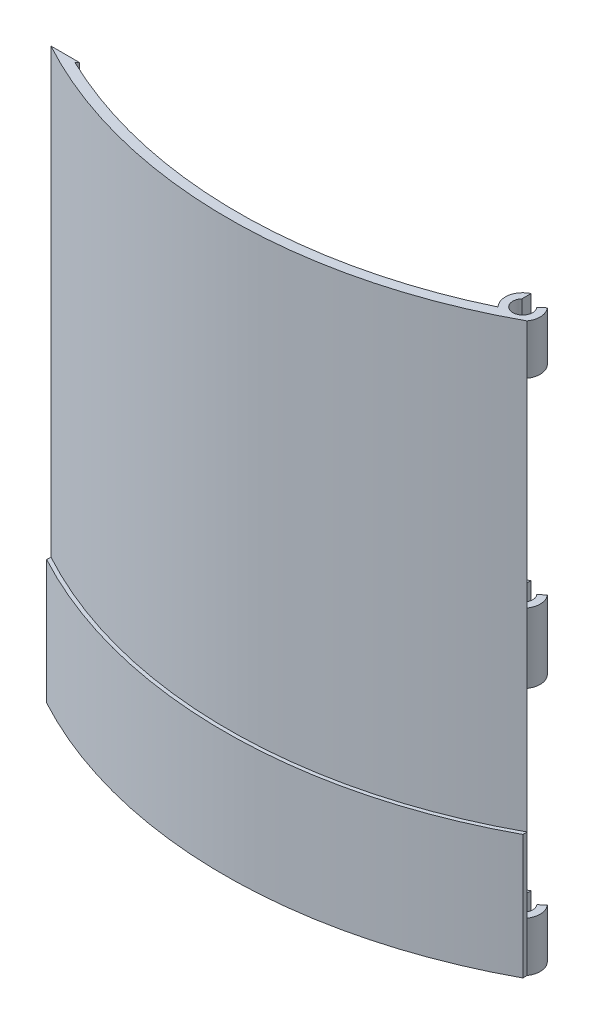
ISO-10303-21;
HEADER;
FILE_DESCRIPTION(('STEP AP214'),'2;1');
FILE_NAME('part.step','',(''),(''),'','','');
FILE_SCHEMA(('AUTOMOTIVE_DESIGN { 1 0 10303 214 1 1 1 1 }'));
ENDSEC;
DATA;
#1=APPLICATION_CONTEXT('core data for automotive mechanical design processes');
#2=APPLICATION_PROTOCOL_DEFINITION('international standard','automotive_design',2000,#1);
#3=PRODUCT_CONTEXT('',#1,'mechanical');
#4=PRODUCT('Part','Part','',(#3));
#5=PRODUCT_RELATED_PRODUCT_CATEGORY('part','',(#4));
#6=PRODUCT_DEFINITION_FORMATION('','',#4);
#7=PRODUCT_DEFINITION_CONTEXT('part definition',#1,'design');
#8=PRODUCT_DEFINITION('design','',#6,#7);
#9=PRODUCT_DEFINITION_SHAPE('','',#8);
#10=(LENGTH_UNIT() NAMED_UNIT(*) SI_UNIT(.MILLI.,.METRE.));
#11=(NAMED_UNIT(*) PLANE_ANGLE_UNIT() SI_UNIT($,.RADIAN.));
#12=(NAMED_UNIT(*) SI_UNIT($,.STERADIAN.) SOLID_ANGLE_UNIT());
#13=UNCERTAINTY_MEASURE_WITH_UNIT(LENGTH_MEASURE(1.E-05),#10,'distance_accuracy_value','');
#14=(GEOMETRIC_REPRESENTATION_CONTEXT(3) GLOBAL_UNCERTAINTY_ASSIGNED_CONTEXT((#13)) GLOBAL_UNIT_ASSIGNED_CONTEXT((#10,
#11,#12)) REPRESENTATION_CONTEXT('',''));
#15=CARTESIAN_POINT('',(0.,0.,0.));
#16=DIRECTION('',(0.,0.,1.));
#17=DIRECTION('',(1.,0.,0.));
#18=AXIS2_PLACEMENT_3D('',#15,#16,#17);
#19=CARTESIAN_POINT('',(92.,114.,-2.));
#20=DIRECTION('',(0.,-1.,0.));
#21=DIRECTION('',(0.,0.,-1.));
#22=AXIS2_PLACEMENT_3D('',#19,#20,#21);
#23=CYLINDRICAL_SURFACE('',#22,3.5);
#24=DIRECTION('',(0.,-1.,0.));
#25=VECTOR('',#24,1.);
#26=CARTESIAN_POINT('',(94.872281323269,114.,0.));
#27=LINE('',#26,#25);
#28=CARTESIAN_POINT('',(94.872281323269,64.,0.));
#29=VERTEX_POINT('',#28);
#30=CARTESIAN_POINT('',(94.872281323269,50.,0.));
#31=VERTEX_POINT('',#30);
#32=EDGE_CURVE('E296',#29,#31,#27,.T.);
#33=ORIENTED_EDGE('',*,*,#32,.T.);
#34=CARTESIAN_POINT('',(92.,50.,-2.));
#35=DIRECTION('',(0.,1.,0.));
#36=DIRECTION('',(0.,0.,1.));
#37=AXIS2_PLACEMENT_3D('',#34,#35,#36);
#38=CIRCLE('',#37,3.5);
#39=CARTESIAN_POINT('',(94.625,50.,-4.31503239718152));
#40=VERTEX_POINT('',#39);
#41=EDGE_CURVE('E396',#31,#40,#38,.T.);
#42=ORIENTED_EDGE('',*,*,#41,.T.);
#43=DIRECTION('',(0.,-1.,0.));
#44=VECTOR('',#43,1.);
#45=CARTESIAN_POINT('',(94.625,114.,-4.31503239718152));
#46=LINE('',#45,#44);
#47=CARTESIAN_POINT('',(94.625,64.,-4.31503239718152));
#48=VERTEX_POINT('',#47);
#49=EDGE_CURVE('E336',#48,#40,#46,.T.);
#50=ORIENTED_EDGE('',*,*,#49,.F.);
#51=CARTESIAN_POINT('',(92.,64.,-2.));
#52=DIRECTION('',(0.,-1.,0.));
#53=DIRECTION('',(0.,0.,-1.));
#54=AXIS2_PLACEMENT_3D('',#51,#52,#53);
#55=CIRCLE('',#54,3.5);
#56=EDGE_CURVE('E487',#48,#29,#55,.T.);
#57=ORIENTED_EDGE('',*,*,#56,.T.);
#58=EDGE_LOOP('',(#33,#42,#50,#57));
#59=FACE_BOUND('',#58,.T.);
#60=ADVANCED_FACE('F35',(#59),#23,.T.);
#61=CARTESIAN_POINT('',(94.625,9.99999999999999,-4.31503239718152));
#62=VERTEX_POINT('',#61);
#63=CARTESIAN_POINT('',(94.625,0.,-4.31503239718152));
#64=VERTEX_POINT('',#63);
#65=EDGE_CURVE('E330',#62,#64,#46,.T.);
#66=ORIENTED_EDGE('',*,*,#65,.F.);
#67=CARTESIAN_POINT('',(92.,9.99999999999999,-2.));
#68=DIRECTION('',(0.,-1.,0.));
#69=DIRECTION('',(1.,0.,0.));
#70=AXIS2_PLACEMENT_3D('',#67,#68,#69);
#71=CIRCLE('',#70,3.5);
#72=CARTESIAN_POINT('',(94.872281323269,10.,0.));
#73=VERTEX_POINT('',#72);
#74=EDGE_CURVE('E384',#62,#73,#71,.T.);
#75=ORIENTED_EDGE('',*,*,#74,.T.);
#76=DIRECTION('',(0.,-1.,0.));
#77=VECTOR('',#76,1.);
#78=CARTESIAN_POINT('',(94.872281323269,25.,0.));
#79=LINE('',#78,#77);
#80=CARTESIAN_POINT('',(94.872281323269,0.,0.));
#81=VERTEX_POINT('',#80);
#82=EDGE_CURVE('E411',#73,#81,#79,.T.);
#83=ORIENTED_EDGE('',*,*,#82,.T.);
#84=CARTESIAN_POINT('',(92.,0.,-2.));
#85=DIRECTION('',(0.,1.,0.));
#86=DIRECTION('',(0.,0.,1.));
#87=AXIS2_PLACEMENT_3D('',#84,#85,#86);
#88=CIRCLE('',#87,3.5);
#89=EDGE_CURVE('E419',#81,#64,#88,.T.);
#90=ORIENTED_EDGE('',*,*,#89,.T.);
#91=EDGE_LOOP('',(#66,#75,#83,#90));
#92=FACE_BOUND('',#91,.T.);
#93=ADVANCED_FACE('F600',(#92),#23,.T.);
#94=CARTESIAN_POINT('',(93.5,114.,-3.32287565553229));
#95=DIRECTION('',(0.661437827766148,0.,0.75));
#96=DIRECTION('',(0.75,0.,-0.661437827766148));
#97=AXIS2_PLACEMENT_3D('',#94,#95,#96);
#98=PLANE('',#97);
#99=ORIENTED_EDGE('',*,*,#49,.T.);
#100=DIRECTION('',(-0.75,0.,0.661437827766148));
#101=VECTOR('',#100,1.);
#102=CARTESIAN_POINT('',(93.5,50.,-3.32287565553229));
#103=LINE('',#102,#101);
#104=CARTESIAN_POINT('',(93.5,50.,-3.32287565553229));
#105=VERTEX_POINT('',#104);
#106=EDGE_CURVE('E393',#40,#105,#103,.T.);
#107=ORIENTED_EDGE('',*,*,#106,.T.);
#108=DIRECTION('',(0.,-1.,0.));
#109=VECTOR('',#108,1.);
#110=CARTESIAN_POINT('',(93.5,114.,-3.32287565553229));
#111=LINE('',#110,#109);
#112=CARTESIAN_POINT('',(93.5,64.,-3.32287565553229));
#113=VERTEX_POINT('',#112);
#114=EDGE_CURVE('E331',#113,#105,#111,.T.);
#115=ORIENTED_EDGE('',*,*,#114,.F.);
#116=DIRECTION('',(0.75,0.,-0.661437827766148));
#117=VECTOR('',#116,1.);
#118=CARTESIAN_POINT('',(93.5,64.,-3.32287565553229));
#119=LINE('',#118,#117);
#120=EDGE_CURVE('E484',#113,#48,#119,.T.);
#121=ORIENTED_EDGE('',*,*,#120,.T.);
#122=EDGE_LOOP('',(#99,#107,#115,#121));
#123=FACE_BOUND('',#122,.T.);
#124=ADVANCED_FACE('F515',(#123),#98,.F.);
#125=CARTESIAN_POINT('',(93.5,9.99999999999999,-3.32287565553229));
#126=VERTEX_POINT('',#125);
#127=CARTESIAN_POINT('',(93.5,0.,-3.32287565553229));
#128=VERTEX_POINT('',#127);
#129=EDGE_CURVE('E325',#126,#128,#111,.T.);
#130=ORIENTED_EDGE('',*,*,#129,.F.);
#131=DIRECTION('',(0.75,0.,-0.661437827766148));
#132=VECTOR('',#131,1.);
#133=CARTESIAN_POINT('',(93.5,9.99999999999999,-3.3228756555323));
#134=LINE('',#133,#132);
#135=EDGE_CURVE('E389',#126,#62,#134,.T.);
#136=ORIENTED_EDGE('',*,*,#135,.T.);
#137=ORIENTED_EDGE('',*,*,#65,.T.);
#138=DIRECTION('',(-0.75,0.,0.661437827766148));
#139=VECTOR('',#138,1.);
#140=CARTESIAN_POINT('',(93.5,0.,-3.32287565553229));
#141=LINE('',#140,#139);
#142=EDGE_CURVE('E442',#64,#128,#141,.T.);
#143=ORIENTED_EDGE('',*,*,#142,.T.);
#144=EDGE_LOOP('',(#130,#136,#137,#143));
#145=FACE_BOUND('',#144,.T.);
#146=ADVANCED_FACE('F504',(#145),#98,.F.);
#147=CARTESIAN_POINT('',(92.,114.,-2.));
#148=DIRECTION('',(0.,-1.,0.));
#149=DIRECTION('',(0.,0.,-1.));
#150=AXIS2_PLACEMENT_3D('',#147,#148,#149);
#151=CYLINDRICAL_SURFACE('',#150,2.);
#152=CARTESIAN_POINT('',(92.,9.99999999999999,-2.));
#153=DIRECTION('',(0.,-1.,0.));
#154=DIRECTION('',(1.,0.,0.));
#155=AXIS2_PLACEMENT_3D('',#152,#153,#154);
#156=CIRCLE('',#155,2.);
#157=CARTESIAN_POINT('',(90.5,9.99999999999999,-3.32287565553229));
#158=VERTEX_POINT('',#157);
#159=CARTESIAN_POINT('',(92.,10.,0.));
#160=VERTEX_POINT('',#159);
#161=EDGE_CURVE('E491',#158,#160,#156,.F.);
#162=ORIENTED_EDGE('',*,*,#161,.T.);
#163=EDGE_CURVE('E493',#160,#126,#156,.F.);
#164=ORIENTED_EDGE('',*,*,#163,.T.);
#165=ORIENTED_EDGE('',*,*,#129,.T.);
#166=CARTESIAN_POINT('',(92.,0.,-2.));
#167=DIRECTION('',(0.,-1.,0.));
#168=DIRECTION('',(0.,0.,1.));
#169=AXIS2_PLACEMENT_3D('',#166,#167,#168);
#170=CIRCLE('',#169,2.);
#171=CARTESIAN_POINT('',(90.5,0.,-3.32287565553229));
#172=VERTEX_POINT('',#171);
#173=EDGE_CURVE('E445',#128,#172,#170,.T.);
#174=ORIENTED_EDGE('',*,*,#173,.T.);
#175=DIRECTION('',(0.,-1.,0.));
#176=VECTOR('',#175,1.);
#177=CARTESIAN_POINT('',(90.5,114.,-3.32287565553229));
#178=LINE('',#177,#176);
#179=EDGE_CURVE('E320',#158,#172,#178,.T.);
#180=ORIENTED_EDGE('',*,*,#179,.F.);
#181=EDGE_LOOP('',(#162,#164,#165,#174,#180));
#182=FACE_BOUND('',#181,.T.);
#183=ADVANCED_FACE('F500',(#182),#151,.F.);
#184=CARTESIAN_POINT('',(92.,104.,-2.));
#185=DIRECTION('',(0.,1.,0.));
#186=DIRECTION('',(0.,0.,1.));
#187=AXIS2_PLACEMENT_3D('',#184,#185,#186);
#188=CIRCLE('',#187,2.);
#189=CARTESIAN_POINT('',(93.5,104.,-3.32287565553229));
#190=VERTEX_POINT('',#189);
#191=CARTESIAN_POINT('',(92.,104.,0.));
#192=VERTEX_POINT('',#191);
#193=EDGE_CURVE('E467',#190,#192,#188,.F.);
#194=ORIENTED_EDGE('',*,*,#193,.T.);
#195=CARTESIAN_POINT('',(90.5,104.,-3.32287565553229));
#196=VERTEX_POINT('',#195);
#197=EDGE_CURVE('E464',#192,#196,#188,.F.);
#198=ORIENTED_EDGE('',*,*,#197,.T.);
#199=CARTESIAN_POINT('',(90.5,114.,-3.32287565553229));
#200=VERTEX_POINT('',#199);
#201=EDGE_CURVE('E322',#200,#196,#178,.T.);
#202=ORIENTED_EDGE('',*,*,#201,.F.);
#203=CARTESIAN_POINT('',(92.,114.,-2.));
#204=DIRECTION('',(0.,-1.,0.));
#205=DIRECTION('',(0.,0.,1.));
#206=AXIS2_PLACEMENT_3D('',#203,#204,#205);
#207=CIRCLE('',#206,2.);
#208=CARTESIAN_POINT('',(93.5,114.,-3.32287565553229));
#209=VERTEX_POINT('',#208);
#210=EDGE_CURVE('E427',#209,#200,#207,.T.);
#211=ORIENTED_EDGE('',*,*,#210,.F.);
#212=EDGE_CURVE('E327',#209,#190,#111,.T.);
#213=ORIENTED_EDGE('',*,*,#212,.T.);
#214=EDGE_LOOP('',(#194,#198,#202,#211,#213));
#215=FACE_BOUND('',#214,.T.);
#216=ADVANCED_FACE('F644',(#215),#151,.F.);
#217=CARTESIAN_POINT('',(90.5,114.,-3.32287565553229));
#218=DIRECTION('',(-1.,0.,0.));
#219=DIRECTION('',(0.,0.,1.));
#220=AXIS2_PLACEMENT_3D('',#217,#218,#219);
#221=PLANE('',#220);
#222=CARTESIAN_POINT('',(90.5,64.,-3.32287565553229));
#223=VERTEX_POINT('',#222);
#224=CARTESIAN_POINT('',(90.5,50.,-3.32287565553229));
#225=VERTEX_POINT('',#224);
#226=EDGE_CURVE('E326',#223,#225,#178,.T.);
#227=ORIENTED_EDGE('',*,*,#226,.T.);
#228=DIRECTION('',(0.,0.,-1.));
#229=VECTOR('',#228,1.);
#230=CARTESIAN_POINT('',(90.5,50.,-3.32287565553229));
#231=LINE('',#230,#229);
#232=CARTESIAN_POINT('',(90.5,50.,-5.16227766016839));
#233=VERTEX_POINT('',#232);
#234=EDGE_CURVE('E380',#225,#233,#231,.T.);
#235=ORIENTED_EDGE('',*,*,#234,.T.);
#236=DIRECTION('',(0.,-1.,0.));
#237=VECTOR('',#236,1.);
#238=CARTESIAN_POINT('',(90.5,114.,-5.16227766016838));
#239=LINE('',#238,#237);
#240=CARTESIAN_POINT('',(90.5,64.,-5.16227766016839));
#241=VERTEX_POINT('',#240);
#242=EDGE_CURVE('E321',#241,#233,#239,.T.);
#243=ORIENTED_EDGE('',*,*,#242,.F.);
#244=DIRECTION('',(0.,0.,1.));
#245=VECTOR('',#244,1.);
#246=CARTESIAN_POINT('',(90.5,64.,-3.32287565553229));
#247=LINE('',#246,#245);
#248=EDGE_CURVE('E378',#241,#223,#247,.T.);
#249=ORIENTED_EDGE('',*,*,#248,.T.);
#250=EDGE_LOOP('',(#227,#235,#243,#249));
#251=FACE_BOUND('',#250,.T.);
#252=ADVANCED_FACE('F377',(#251),#221,.F.);
#253=CARTESIAN_POINT('',(90.5,9.99999999999999,-5.16227766016839));
#254=VERTEX_POINT('',#253);
#255=CARTESIAN_POINT('',(90.5,0.,-5.16227766016838));
#256=VERTEX_POINT('',#255);
#257=EDGE_CURVE('E316',#254,#256,#239,.T.);
#258=ORIENTED_EDGE('',*,*,#257,.F.);
#259=DIRECTION('',(0.,0.,1.));
#260=VECTOR('',#259,1.);
#261=CARTESIAN_POINT('',(90.5,9.99999999999999,-3.32287565553229));
#262=LINE('',#261,#260);
#263=EDGE_CURVE('E366',#254,#158,#262,.T.);
#264=ORIENTED_EDGE('',*,*,#263,.T.);
#265=ORIENTED_EDGE('',*,*,#179,.T.);
#266=DIRECTION('',(0.,0.,-1.));
#267=VECTOR('',#266,1.);
#268=CARTESIAN_POINT('',(90.5,0.,-3.32287565553229));
#269=LINE('',#268,#267);
#270=EDGE_CURVE('E369',#172,#256,#269,.T.);
#271=ORIENTED_EDGE('',*,*,#270,.T.);
#272=EDGE_LOOP('',(#258,#264,#265,#271));
#273=FACE_BOUND('',#272,.T.);
#274=ADVANCED_FACE('F365',(#273),#221,.F.);
#275=CARTESIAN_POINT('',(92.,114.,-2.));
#276=DIRECTION('',(0.,1.,0.));
#277=DIRECTION('',(0.,0.,1.));
#278=AXIS2_PLACEMENT_3D('',#275,#276,#277);
#279=PLANE('',#278);
#280=CARTESIAN_POINT('',(2.,114.,-2.));
#281=DIRECTION('',(0.,1.,0.));
#282=DIRECTION('',(0.,0.,-1.));
#283=AXIS2_PLACEMENT_3D('',#280,#281,#282);
#284=CIRCLE('',#283,3.50000000000001);
#285=CARTESIAN_POINT('',(4.46044987501541,114.,0.489214015012882));
#286=VERTEX_POINT('',#285);
#287=CARTESIAN_POINT('',(4.87228132326903,114.,0.));
#288=VERTEX_POINT('',#287);
#289=EDGE_CURVE('E435',#286,#288,#284,.T.);
#290=ORIENTED_EDGE('',*,*,#289,.T.);
#291=DIRECTION('',(-1.,0.,0.));
#292=VECTOR('',#291,1.);
#293=CARTESIAN_POINT('',(92.,114.,0.));
#294=LINE('',#293,#292);
#295=CARTESIAN_POINT('',(-0.87228132326901,114.,0.));
#296=VERTEX_POINT('',#295);
#297=EDGE_CURVE('E335',#288,#296,#294,.T.);
#298=ORIENTED_EDGE('',*,*,#297,.T.);
#299=CARTESIAN_POINT('',(47.,114.,-87.7966097346919));
#300=DIRECTION('',(0.,1.,0.));
#301=DIRECTION('',(0.,0.,1.));
#302=AXIS2_PLACEMENT_3D('',#299,#300,#301);
#303=CIRCLE('',#302,100.);
#304=CARTESIAN_POINT('',(94.872281323269,114.,0.));
#305=VERTEX_POINT('',#304);
#306=EDGE_CURVE('E438',#296,#305,#303,.T.);
#307=ORIENTED_EDGE('',*,*,#306,.T.);
#308=CARTESIAN_POINT('',(92.,114.,-2.));
#309=DIRECTION('',(0.,1.,0.));
#310=DIRECTION('',(0.,0.,1.));
#311=AXIS2_PLACEMENT_3D('',#308,#309,#310);
#312=CIRCLE('',#311,3.5);
#313=CARTESIAN_POINT('',(94.625,114.,-4.31503239718152));
#314=VERTEX_POINT('',#313);
#315=EDGE_CURVE('E282',#305,#314,#312,.T.);
#316=ORIENTED_EDGE('',*,*,#315,.T.);
#317=DIRECTION('',(-0.75,0.,0.661437827766148));
#318=VECTOR('',#317,1.);
#319=CARTESIAN_POINT('',(93.5,114.,-3.32287565553229));
#320=LINE('',#319,#318);
#321=EDGE_CURVE('E286',#314,#209,#320,.T.);
#322=ORIENTED_EDGE('',*,*,#321,.T.);
#323=ORIENTED_EDGE('',*,*,#210,.T.);
#324=DIRECTION('',(0.,0.,-1.));
#325=VECTOR('',#324,1.);
#326=CARTESIAN_POINT('',(90.5,114.,-3.32287565553229));
#327=LINE('',#326,#325);
#328=CARTESIAN_POINT('',(90.5,114.,-5.16227766016838));
#329=VERTEX_POINT('',#328);
#330=EDGE_CURVE('E429',#200,#329,#327,.T.);
#331=ORIENTED_EDGE('',*,*,#330,.T.);
#332=CARTESIAN_POINT('',(92.,114.,-2.));
#333=DIRECTION('',(0.,1.,0.));
#334=DIRECTION('',(0.,0.,1.));
#335=AXIS2_PLACEMENT_3D('',#332,#333,#334);
#336=CIRCLE('',#335,3.50000000000001);
#337=CARTESIAN_POINT('',(89.5395501249846,114.,0.489214015012884));
#338=VERTEX_POINT('',#337);
#339=EDGE_CURVE('E431',#329,#338,#336,.T.);
#340=ORIENTED_EDGE('',*,*,#339,.T.);
#341=CARTESIAN_POINT('',(47.,114.,-87.7966097346919));
#342=DIRECTION('',(0.,-1.,0.));
#343=DIRECTION('',(0.,0.,1.));
#344=AXIS2_PLACEMENT_3D('',#341,#342,#343);
#345=CIRCLE('',#344,98.);
#346=EDGE_CURVE('E433',#338,#286,#345,.T.);
#347=ORIENTED_EDGE('',*,*,#346,.T.);
#348=EDGE_LOOP('',(#290,#298,#307,#316,#322,#323,#331,#340,#347));
#349=FACE_BOUND('',#348,.T.);
#350=ADVANCED_FACE('F454',(#349),#279,.T.);
#351=CARTESIAN_POINT('',(92.,0.,-2.));
#352=DIRECTION('',(0.,1.,0.));
#353=DIRECTION('',(0.,0.,1.));
#354=AXIS2_PLACEMENT_3D('',#351,#352,#353);
#355=PLANE('',#354);
#356=DIRECTION('',(1.,0.,0.));
#357=VECTOR('',#356,1.);
#358=CARTESIAN_POINT('',(-8.45376669186193,0.,0.));
#359=LINE('',#358,#357);
#360=CARTESIAN_POINT('',(-0.87228132326901,0.,0.));
#361=VERTEX_POINT('',#360);
#362=CARTESIAN_POINT('',(4.87228132326903,0.,0.));
#363=VERTEX_POINT('',#362);
#364=EDGE_CURVE('E255',#361,#363,#359,.T.);
#365=ORIENTED_EDGE('',*,*,#364,.T.);
#366=CARTESIAN_POINT('',(2.,0.,-2.));
#367=DIRECTION('',(0.,1.,0.));
#368=DIRECTION('',(0.,0.,-1.));
#369=AXIS2_PLACEMENT_3D('',#366,#367,#368);
#370=CIRCLE('',#369,3.50000000000001);
#371=CARTESIAN_POINT('',(4.46044987501541,0.,0.489214015012882));
#372=VERTEX_POINT('',#371);
#373=EDGE_CURVE('E270',#372,#363,#370,.T.);
#374=ORIENTED_EDGE('',*,*,#373,.F.);
#375=CARTESIAN_POINT('',(47.,0.,-87.7966097346919));
#376=DIRECTION('',(0.,-1.,0.));
#377=DIRECTION('',(0.,0.,1.));
#378=AXIS2_PLACEMENT_3D('',#375,#376,#377);
#379=CIRCLE('',#378,98.);
#380=CARTESIAN_POINT('',(89.5395501249846,0.,0.489214015012884));
#381=VERTEX_POINT('',#380);
#382=EDGE_CURVE('E283',#381,#372,#379,.T.);
#383=ORIENTED_EDGE('',*,*,#382,.F.);
#384=CARTESIAN_POINT('',(92.,0.,-2.));
#385=DIRECTION('',(0.,1.,0.));
#386=DIRECTION('',(0.,0.,1.));
#387=AXIS2_PLACEMENT_3D('',#384,#385,#386);
#388=CIRCLE('',#387,3.50000000000001);
#389=EDGE_CURVE('E288',#256,#381,#388,.T.);
#390=ORIENTED_EDGE('',*,*,#389,.F.);
#391=ORIENTED_EDGE('',*,*,#270,.F.);
#392=ORIENTED_EDGE('',*,*,#173,.F.);
#393=ORIENTED_EDGE('',*,*,#142,.F.);
#394=ORIENTED_EDGE('',*,*,#89,.F.);
#395=DIRECTION('',(0.,0.,1.));
#396=VECTOR('',#395,1.);
#397=CARTESIAN_POINT('',(94.872281323269,0.,0.));
#398=LINE('',#397,#396);
#399=CARTESIAN_POINT('',(94.8722813232691,0.,0.853303863155408));
#400=VERTEX_POINT('',#399);
#401=EDGE_CURVE('E399',#81,#400,#398,.T.);
#402=ORIENTED_EDGE('',*,*,#401,.T.);
#403=CARTESIAN_POINT('',(47.,0.,-87.7966097346919));
#404=DIRECTION('',(0.,-1.,0.));
#405=DIRECTION('',(0.,0.,-1.));
#406=AXIS2_PLACEMENT_3D('',#403,#404,#405);
#407=CIRCLE('',#406,100.75);
#408=CARTESIAN_POINT('',(-0.872281323269011,0.,0.853303863155422));
#409=VERTEX_POINT('',#408);
#410=EDGE_CURVE('E414',#400,#409,#407,.T.);
#411=ORIENTED_EDGE('',*,*,#410,.T.);
#412=DIRECTION('',(0.,0.,-1.));
#413=VECTOR('',#412,1.);
#414=CARTESIAN_POINT('',(-0.87228132326901,0.,0.));
#415=LINE('',#414,#413);
#416=EDGE_CURVE('E273',#409,#361,#415,.T.);
#417=ORIENTED_EDGE('',*,*,#416,.T.);
#418=EDGE_LOOP('',(#365,#374,#383,#390,#391,#392,#393,#394,#402,#411,#417));
#419=FACE_BOUND('',#418,.T.);
#420=ADVANCED_FACE('F268',(#419),#355,.F.);
#421=CARTESIAN_POINT('',(47.,114.,-87.7966097346919));
#422=DIRECTION('',(0.,-1.,0.));
#423=DIRECTION('',(0.,0.,-1.));
#424=AXIS2_PLACEMENT_3D('',#421,#422,#423);
#425=CYLINDRICAL_SURFACE('',#424,100.);
#426=CARTESIAN_POINT('',(47.,25.,-87.7966097346919));
#427=DIRECTION('',(0.,1.,0.));
#428=DIRECTION('',(0.,0.,-1.));
#429=AXIS2_PLACEMENT_3D('',#426,#427,#428);
#430=CIRCLE('',#429,100.);
#431=CARTESIAN_POINT('',(-0.872281323269011,25.,0.));
#432=VERTEX_POINT('',#431);
#433=CARTESIAN_POINT('',(94.872281323269,25.,0.));
#434=VERTEX_POINT('',#433);
#435=EDGE_CURVE('E400',#432,#434,#430,.T.);
#436=ORIENTED_EDGE('',*,*,#435,.T.);
#437=DIRECTION('',(0.,-1.,0.));
#438=VECTOR('',#437,1.);
#439=CARTESIAN_POINT('',(94.872281323269,114.,0.));
#440=LINE('',#439,#438);
#441=EDGE_CURVE('E58',#31,#434,#440,.T.);
#442=ORIENTED_EDGE('',*,*,#441,.F.);
#443=ORIENTED_EDGE('',*,*,#32,.F.);
#444=DIRECTION('',(0.,-1.,0.));
#445=VECTOR('',#444,1.);
#446=CARTESIAN_POINT('',(94.872281323269,114.,0.));
#447=LINE('',#446,#445);
#448=CARTESIAN_POINT('',(94.872281323269,104.,0.));
#449=VERTEX_POINT('',#448);
#450=EDGE_CURVE('E465',#449,#29,#447,.T.);
#451=ORIENTED_EDGE('',*,*,#450,.F.);
#452=EDGE_CURVE('E292',#305,#449,#27,.T.);
#453=ORIENTED_EDGE('',*,*,#452,.F.);
#454=ORIENTED_EDGE('',*,*,#306,.F.);
#455=DIRECTION('',(0.,-1.,0.));
#456=VECTOR('',#455,1.);
#457=CARTESIAN_POINT('',(-0.87228132326901,114.,0.));
#458=LINE('',#457,#456);
#459=CARTESIAN_POINT('',(-0.872281323269011,64.,0.));
#460=VERTEX_POINT('',#459);
#461=EDGE_CURVE('E297',#296,#460,#458,.T.);
#462=ORIENTED_EDGE('',*,*,#461,.T.);
#463=CARTESIAN_POINT('',(-0.872281323269011,50.,0.));
#464=VERTEX_POINT('',#463);
#465=EDGE_CURVE('E295',#460,#464,#458,.T.);
#466=ORIENTED_EDGE('',*,*,#465,.T.);
#467=DIRECTION('',(0.,-1.,0.));
#468=VECTOR('',#467,1.);
#469=CARTESIAN_POINT('',(-0.872281323269011,114.,0.));
#470=LINE('',#469,#468);
#471=EDGE_CURVE('E263',#432,#464,#470,.F.);
#472=ORIENTED_EDGE('',*,*,#471,.F.);
#473=EDGE_LOOP('',(#436,#442,#443,#451,#453,#454,#462,#466,#472));
#474=FACE_BOUND('',#473,.T.);
#475=ADVANCED_FACE('F525',(#474),#425,.T.);
#476=ORIENTED_EDGE('',*,*,#452,.T.);
#477=CARTESIAN_POINT('',(92.,104.,-2.));
#478=DIRECTION('',(0.,1.,0.));
#479=DIRECTION('',(0.,0.,1.));
#480=AXIS2_PLACEMENT_3D('',#477,#478,#479);
#481=CIRCLE('',#480,3.5);
#482=CARTESIAN_POINT('',(94.625,104.,-4.31503239718152));
#483=VERTEX_POINT('',#482);
#484=EDGE_CURVE('E476',#449,#483,#481,.T.);
#485=ORIENTED_EDGE('',*,*,#484,.T.);
#486=EDGE_CURVE('E332',#314,#483,#46,.T.);
#487=ORIENTED_EDGE('',*,*,#486,.F.);
#488=ORIENTED_EDGE('',*,*,#315,.F.);
#489=EDGE_LOOP('',(#476,#485,#487,#488));
#490=FACE_BOUND('',#489,.T.);
#491=ADVANCED_FACE('F37',(#490),#23,.T.);
#492=ORIENTED_EDGE('',*,*,#486,.T.);
#493=DIRECTION('',(-0.75,0.,0.661437827766148));
#494=VECTOR('',#493,1.);
#495=CARTESIAN_POINT('',(93.5,104.,-3.32287565553229));
#496=LINE('',#495,#494);
#497=EDGE_CURVE('E473',#483,#190,#496,.T.);
#498=ORIENTED_EDGE('',*,*,#497,.T.);
#499=ORIENTED_EDGE('',*,*,#212,.F.);
#500=ORIENTED_EDGE('',*,*,#321,.F.);
#501=EDGE_LOOP('',(#492,#498,#499,#500));
#502=FACE_BOUND('',#501,.T.);
#503=ADVANCED_FACE('F629',(#502),#98,.F.);
#504=CARTESIAN_POINT('',(92.,50.,-2.));
#505=DIRECTION('',(0.,1.,0.));
#506=DIRECTION('',(0.,0.,1.));
#507=AXIS2_PLACEMENT_3D('',#504,#505,#506);
#508=CIRCLE('',#507,2.);
#509=CARTESIAN_POINT('',(92.,50.,0.));
#510=VERTEX_POINT('',#509);
#511=EDGE_CURVE('E386',#105,#510,#508,.F.);
#512=ORIENTED_EDGE('',*,*,#511,.T.);
#513=EDGE_CURVE('E383',#510,#225,#508,.F.);
#514=ORIENTED_EDGE('',*,*,#513,.T.);
#515=ORIENTED_EDGE('',*,*,#226,.F.);
#516=CARTESIAN_POINT('',(92.,64.,-2.));
#517=DIRECTION('',(0.,-1.,0.));
#518=DIRECTION('',(0.,0.,-1.));
#519=AXIS2_PLACEMENT_3D('',#516,#517,#518);
#520=CIRCLE('',#519,2.);
#521=CARTESIAN_POINT('',(92.,64.,0.));
#522=VERTEX_POINT('',#521);
#523=EDGE_CURVE('E480',#223,#522,#520,.F.);
#524=ORIENTED_EDGE('',*,*,#523,.T.);
#525=EDGE_CURVE('E483',#522,#113,#520,.F.);
#526=ORIENTED_EDGE('',*,*,#525,.T.);
#527=ORIENTED_EDGE('',*,*,#114,.T.);
#528=EDGE_LOOP('',(#512,#514,#515,#524,#526,#527));
#529=FACE_BOUND('',#528,.T.);
#530=ADVANCED_FACE('F512',(#529),#151,.F.);
#531=ORIENTED_EDGE('',*,*,#201,.T.);
#532=DIRECTION('',(0.,0.,-1.));
#533=VECTOR('',#532,1.);
#534=CARTESIAN_POINT('',(90.5,104.,-3.32287565553229));
#535=LINE('',#534,#533);
#536=CARTESIAN_POINT('',(90.5,104.,-5.16227766016839));
#537=VERTEX_POINT('',#536);
#538=EDGE_CURVE('E460',#196,#537,#535,.T.);
#539=ORIENTED_EDGE('',*,*,#538,.T.);
#540=EDGE_CURVE('E317',#329,#537,#239,.T.);
#541=ORIENTED_EDGE('',*,*,#540,.F.);
#542=ORIENTED_EDGE('',*,*,#330,.F.);
#543=EDGE_LOOP('',(#531,#539,#541,#542));
#544=FACE_BOUND('',#543,.T.);
#545=ADVANCED_FACE('F459',(#544),#221,.F.);
#546=CARTESIAN_POINT('',(92.,114.,-2.));
#547=DIRECTION('',(0.,-1.,0.));
#548=DIRECTION('',(0.,0.,-1.));
#549=AXIS2_PLACEMENT_3D('',#546,#547,#548);
#550=CYLINDRICAL_SURFACE('',#549,3.50000000000001);
#551=ORIENTED_EDGE('',*,*,#242,.T.);
#552=CARTESIAN_POINT('',(92.,50.,-2.));
#553=DIRECTION('',(0.,1.,0.));
#554=DIRECTION('',(0.,0.,1.));
#555=AXIS2_PLACEMENT_3D('',#552,#553,#554);
#556=CIRCLE('',#555,3.50000000000001);
#557=CARTESIAN_POINT('',(89.127718676731,50.,0.));
#558=VERTEX_POINT('',#557);
#559=EDGE_CURVE('E11',#233,#558,#556,.T.);
#560=ORIENTED_EDGE('',*,*,#559,.T.);
#561=DIRECTION('',(0.,-1.,0.));
#562=VECTOR('',#561,1.);
#563=CARTESIAN_POINT('',(89.127718676731,114.,0.));
#564=LINE('',#563,#562);
#565=CARTESIAN_POINT('',(89.127718676731,10.,0.));
#566=VERTEX_POINT('',#565);
#567=EDGE_CURVE('E359',#566,#558,#564,.F.);
#568=ORIENTED_EDGE('',*,*,#567,.F.);
#569=CARTESIAN_POINT('',(92.,9.99999999999999,-2.));
#570=DIRECTION('',(0.,-1.,0.));
#571=DIRECTION('',(1.,0.,0.));
#572=AXIS2_PLACEMENT_3D('',#569,#570,#571);
#573=CIRCLE('',#572,3.50000000000001);
#574=EDGE_CURVE('E43',#566,#254,#573,.T.);
#575=ORIENTED_EDGE('',*,*,#574,.T.);
#576=ORIENTED_EDGE('',*,*,#257,.T.);
#577=ORIENTED_EDGE('',*,*,#389,.T.);
#578=DIRECTION('',(0.,-1.,0.));
#579=VECTOR('',#578,1.);
#580=CARTESIAN_POINT('',(89.5395501249846,114.,0.489214015012884));
#581=LINE('',#580,#579);
#582=EDGE_CURVE('E313',#338,#381,#581,.T.);
#583=ORIENTED_EDGE('',*,*,#582,.F.);
#584=ORIENTED_EDGE('',*,*,#339,.F.);
#585=ORIENTED_EDGE('',*,*,#540,.T.);
#586=CARTESIAN_POINT('',(92.,104.,-2.));
#587=DIRECTION('',(0.,1.,0.));
#588=DIRECTION('',(0.,0.,1.));
#589=AXIS2_PLACEMENT_3D('',#586,#587,#588);
#590=CIRCLE('',#589,3.50000000000001);
#591=CARTESIAN_POINT('',(89.127718676731,104.,0.));
#592=VERTEX_POINT('',#591);
#593=EDGE_CURVE('E347',#537,#592,#590,.T.);
#594=ORIENTED_EDGE('',*,*,#593,.T.);
#595=DIRECTION('',(0.,-1.,0.));
#596=VECTOR('',#595,1.);
#597=CARTESIAN_POINT('',(89.127718676731,114.,0.));
#598=LINE('',#597,#596);
#599=CARTESIAN_POINT('',(89.127718676731,64.,0.));
#600=VERTEX_POINT('',#599);
#601=EDGE_CURVE('E345',#600,#592,#598,.F.);
#602=ORIENTED_EDGE('',*,*,#601,.F.);
#603=CARTESIAN_POINT('',(92.,64.,-2.));
#604=DIRECTION('',(0.,-1.,0.));
#605=DIRECTION('',(0.,0.,-1.));
#606=AXIS2_PLACEMENT_3D('',#603,#604,#605);
#607=CIRCLE('',#606,3.50000000000001);
#608=EDGE_CURVE('E350',#600,#241,#607,.T.);
#609=ORIENTED_EDGE('',*,*,#608,.T.);
#610=EDGE_LOOP('',(#551,#560,#568,#575,#576,#577,#583,#584,#585,#594,#602,#609));
#611=FACE_BOUND('',#610,.T.);
#612=ADVANCED_FACE('F357',(#611),#550,.T.);
#613=CARTESIAN_POINT('',(47.,114.,-87.7966097346919));
#614=DIRECTION('',(0.,-1.,0.));
#615=DIRECTION('',(0.,0.,-1.));
#616=AXIS2_PLACEMENT_3D('',#613,#614,#615);
#617=CYLINDRICAL_SURFACE('',#616,98.);
#618=ORIENTED_EDGE('',*,*,#382,.T.);
#619=DIRECTION('',(0.,-1.,0.));
#620=VECTOR('',#619,1.);
#621=CARTESIAN_POINT('',(4.46044987501541,114.,0.489214015012882));
#622=LINE('',#621,#620);
#623=EDGE_CURVE('E281',#286,#372,#622,.T.);
#624=ORIENTED_EDGE('',*,*,#623,.F.);
#625=ORIENTED_EDGE('',*,*,#346,.F.);
#626=ORIENTED_EDGE('',*,*,#582,.T.);
#627=EDGE_LOOP('',(#618,#624,#625,#626));
#628=FACE_BOUND('',#627,.T.);
#629=ADVANCED_FACE('F452',(#628),#617,.F.);
#630=CARTESIAN_POINT('',(2.,114.,-2.));
#631=DIRECTION('',(0.,-1.,0.));
#632=DIRECTION('',(0.,0.,-1.));
#633=AXIS2_PLACEMENT_3D('',#630,#631,#632);
#634=CYLINDRICAL_SURFACE('',#633,3.50000000000001);
#635=DIRECTION('',(0.,-1.,0.));
#636=VECTOR('',#635,1.);
#637=CARTESIAN_POINT('',(3.50000000000001,114.,-5.16227766016839));
#638=LINE('',#637,#636);
#639=CARTESIAN_POINT('',(3.5,64.,-5.16227766016839));
#640=VERTEX_POINT('',#639);
#641=CARTESIAN_POINT('',(3.5,50.,-5.16227766016839));
#642=VERTEX_POINT('',#641);
#643=EDGE_CURVE('E309',#640,#642,#638,.T.);
#644=ORIENTED_EDGE('',*,*,#643,.F.);
#645=CARTESIAN_POINT('',(2.,64.,-2.));
#646=DIRECTION('',(0.,-1.,0.));
#647=DIRECTION('',(0.,0.,-1.));
#648=AXIS2_PLACEMENT_3D('',#645,#646,#647);
#649=CIRCLE('',#648,3.50000000000001);
#650=CARTESIAN_POINT('',(4.87228132326903,64.,0.));
#651=VERTEX_POINT('',#650);
#652=EDGE_CURVE('E469',#640,#651,#649,.T.);
#653=ORIENTED_EDGE('',*,*,#652,.T.);
#654=DIRECTION('',(0.,-1.,0.));
#655=VECTOR('',#654,1.);
#656=CARTESIAN_POINT('',(4.87228132326903,114.,0.));
#657=LINE('',#656,#655);
#658=EDGE_CURVE('E531',#288,#651,#657,.T.);
#659=ORIENTED_EDGE('',*,*,#658,.F.);
#660=ORIENTED_EDGE('',*,*,#289,.F.);
#661=ORIENTED_EDGE('',*,*,#623,.T.);
#662=ORIENTED_EDGE('',*,*,#373,.T.);
#663=DIRECTION('',(0.,-1.,0.));
#664=VECTOR('',#663,1.);
#665=CARTESIAN_POINT('',(4.87228132326903,114.,0.));
#666=LINE('',#665,#664);
#667=CARTESIAN_POINT('',(4.87228132326903,50.,0.));
#668=VERTEX_POINT('',#667);
#669=EDGE_CURVE('E252',#668,#363,#666,.T.);
#670=ORIENTED_EDGE('',*,*,#669,.F.);
#671=CARTESIAN_POINT('',(2.,50.,-2.));
#672=DIRECTION('',(0.,1.,0.));
#673=DIRECTION('',(0.,0.,1.));
#674=AXIS2_PLACEMENT_3D('',#671,#672,#673);
#675=CIRCLE('',#674,3.50000000000001);
#676=EDGE_CURVE('E546',#668,#642,#675,.T.);
#677=ORIENTED_EDGE('',*,*,#676,.T.);
#678=EDGE_LOOP('',(#644,#653,#659,#660,#661,#662,#670,#677));
#679=FACE_BOUND('',#678,.T.);
#680=ADVANCED_FACE('F278',(#679),#634,.T.);
#681=CARTESIAN_POINT('',(3.5,114.,-3.32287565553229));
#682=DIRECTION('',(1.,0.,0.));
#683=DIRECTION('',(0.,0.,-1.));
#684=AXIS2_PLACEMENT_3D('',#681,#682,#683);
#685=PLANE('',#684);
#686=DIRECTION('',(0.,-1.,0.));
#687=VECTOR('',#686,1.);
#688=CARTESIAN_POINT('',(3.5,114.,-3.32287565553229));
#689=LINE('',#688,#687);
#690=CARTESIAN_POINT('',(3.5,64.,-3.32287565553229));
#691=VERTEX_POINT('',#690);
#692=CARTESIAN_POINT('',(3.5,50.,-3.32287565553229));
#693=VERTEX_POINT('',#692);
#694=EDGE_CURVE('E306',#691,#693,#689,.T.);
#695=ORIENTED_EDGE('',*,*,#694,.F.);
#696=DIRECTION('',(0.,0.,-1.));
#697=VECTOR('',#696,1.);
#698=CARTESIAN_POINT('',(3.5,64.,-3.32287565553229));
#699=LINE('',#698,#697);
#700=EDGE_CURVE('E555',#691,#640,#699,.T.);
#701=ORIENTED_EDGE('',*,*,#700,.T.);
#702=ORIENTED_EDGE('',*,*,#643,.T.);
#703=DIRECTION('',(0.,0.,1.));
#704=VECTOR('',#703,1.);
#705=CARTESIAN_POINT('',(3.5,50.,-3.32287565553229));
#706=LINE('',#705,#704);
#707=EDGE_CURVE('E543',#642,#693,#706,.T.);
#708=ORIENTED_EDGE('',*,*,#707,.T.);
#709=EDGE_LOOP('',(#695,#701,#702,#708));
#710=FACE_BOUND('',#709,.T.);
#711=ADVANCED_FACE('F567',(#710),#685,.F.);
#712=CARTESIAN_POINT('',(2.,114.,-2.));
#713=DIRECTION('',(0.,-1.,0.));
#714=DIRECTION('',(0.,0.,-1.));
#715=AXIS2_PLACEMENT_3D('',#712,#713,#714);
#716=CYLINDRICAL_SURFACE('',#715,2.);
#717=CARTESIAN_POINT('',(2.,64.,-2.));
#718=DIRECTION('',(0.,-1.,0.));
#719=DIRECTION('',(0.,0.,-1.));
#720=AXIS2_PLACEMENT_3D('',#717,#718,#719);
#721=CIRCLE('',#720,2.);
#722=CARTESIAN_POINT('',(0.499999999999997,64.,-3.32287565553229));
#723=VERTEX_POINT('',#722);
#724=CARTESIAN_POINT('',(2.,64.,0.));
#725=VERTEX_POINT('',#724);
#726=EDGE_CURVE('E551',#723,#725,#721,.F.);
#727=ORIENTED_EDGE('',*,*,#726,.T.);
#728=EDGE_CURVE('E554',#725,#691,#721,.F.);
#729=ORIENTED_EDGE('',*,*,#728,.T.);
#730=ORIENTED_EDGE('',*,*,#694,.T.);
#731=CARTESIAN_POINT('',(2.,50.,-2.));
#732=DIRECTION('',(0.,1.,0.));
#733=DIRECTION('',(0.,0.,1.));
#734=AXIS2_PLACEMENT_3D('',#731,#732,#733);
#735=CIRCLE('',#734,2.);
#736=CARTESIAN_POINT('',(2.,50.,0.));
#737=VERTEX_POINT('',#736);
#738=EDGE_CURVE('E542',#693,#737,#735,.F.);
#739=ORIENTED_EDGE('',*,*,#738,.T.);
#740=CARTESIAN_POINT('',(0.499999999999997,50.,-3.32287565553229));
#741=VERTEX_POINT('',#740);
#742=EDGE_CURVE('E539',#737,#741,#735,.F.);
#743=ORIENTED_EDGE('',*,*,#742,.T.);
#744=DIRECTION('',(0.,-1.,0.));
#745=VECTOR('',#744,1.);
#746=CARTESIAN_POINT('',(0.499999999999998,114.,-3.32287565553229));
#747=LINE('',#746,#745);
#748=EDGE_CURVE('E303',#723,#741,#747,.T.);
#749=ORIENTED_EDGE('',*,*,#748,.F.);
#750=EDGE_LOOP('',(#727,#729,#730,#739,#743,#749));
#751=FACE_BOUND('',#750,.T.);
#752=ADVANCED_FACE('F570',(#751),#716,.F.);
#753=CARTESIAN_POINT('',(0.499999999999997,114.,-3.32287565553229));
#754=DIRECTION('',(-1.,0.,0.));
#755=DIRECTION('',(0.,0.,1.));
#756=AXIS2_PLACEMENT_3D('',#753,#754,#755);
#757=PLANE('',#756);
#758=DIRECTION('',(0.,-1.,0.));
#759=VECTOR('',#758,1.);
#760=CARTESIAN_POINT('',(0.5,114.,-5.16227766016838));
#761=LINE('',#760,#759);
#762=CARTESIAN_POINT('',(0.500000000000001,64.,-5.16227766016838));
#763=VERTEX_POINT('',#762);
#764=CARTESIAN_POINT('',(0.500000000000001,50.,-5.16227766016838));
#765=VERTEX_POINT('',#764);
#766=EDGE_CURVE('E300',#763,#765,#761,.T.);
#767=ORIENTED_EDGE('',*,*,#766,.F.);
#768=DIRECTION('',(0.,0.,1.));
#769=VECTOR('',#768,1.);
#770=CARTESIAN_POINT('',(0.499999999999997,64.,-3.32287565553229));
#771=LINE('',#770,#769);
#772=EDGE_CURVE('E548',#763,#723,#771,.T.);
#773=ORIENTED_EDGE('',*,*,#772,.T.);
#774=ORIENTED_EDGE('',*,*,#748,.T.);
#775=DIRECTION('',(0.,0.,-1.));
#776=VECTOR('',#775,1.);
#777=CARTESIAN_POINT('',(0.499999999999997,50.,-3.32287565553229));
#778=LINE('',#777,#776);
#779=EDGE_CURVE('E536',#741,#765,#778,.T.);
#780=ORIENTED_EDGE('',*,*,#779,.T.);
#781=EDGE_LOOP('',(#767,#773,#774,#780));
#782=FACE_BOUND('',#781,.T.);
#783=ADVANCED_FACE('F811',(#782),#757,.F.);
#784=CARTESIAN_POINT('',(2.,114.,-2.));
#785=DIRECTION('',(0.,-1.,0.));
#786=DIRECTION('',(0.,0.,-1.));
#787=AXIS2_PLACEMENT_3D('',#784,#785,#786);
#788=CYLINDRICAL_SURFACE('',#787,3.5);
#789=ORIENTED_EDGE('',*,*,#465,.F.);
#790=CARTESIAN_POINT('',(2.,64.,-2.));
#791=DIRECTION('',(0.,-1.,0.));
#792=DIRECTION('',(0.,0.,-1.));
#793=AXIS2_PLACEMENT_3D('',#790,#791,#792);
#794=CIRCLE('',#793,3.5);
#795=EDGE_CURVE('E342',#460,#763,#794,.T.);
#796=ORIENTED_EDGE('',*,*,#795,.T.);
#797=ORIENTED_EDGE('',*,*,#766,.T.);
#798=CARTESIAN_POINT('',(2.,50.,-2.));
#799=DIRECTION('',(0.,1.,0.));
#800=DIRECTION('',(0.,0.,1.));
#801=AXIS2_PLACEMENT_3D('',#798,#799,#800);
#802=CIRCLE('',#801,3.5);
#803=EDGE_CURVE('E339',#765,#464,#802,.T.);
#804=ORIENTED_EDGE('',*,*,#803,.T.);
#805=EDGE_LOOP('',(#789,#796,#797,#804));
#806=FACE_BOUND('',#805,.T.);
#807=ADVANCED_FACE('F622',(#806),#788,.T.);
#808=CARTESIAN_POINT('',(-0.87228132326901,25.,0.));
#809=DIRECTION('',(-1.,0.,0.));
#810=DIRECTION('',(0.,0.,1.));
#811=AXIS2_PLACEMENT_3D('',#808,#809,#810);
#812=PLANE('',#811);
#813=ORIENTED_EDGE('',*,*,#416,.F.);
#814=DIRECTION('',(0.,-1.,0.));
#815=VECTOR('',#814,1.);
#816=CARTESIAN_POINT('',(-0.872281323269011,25.,0.853303863155422));
#817=LINE('',#816,#815);
#818=CARTESIAN_POINT('',(-0.872281323269011,25.,0.853303863155422));
#819=VERTEX_POINT('',#818);
#820=EDGE_CURVE('E420',#819,#409,#817,.T.);
#821=ORIENTED_EDGE('',*,*,#820,.F.);
#822=DIRECTION('',(0.,0.,-1.));
#823=VECTOR('',#822,1.);
#824=CARTESIAN_POINT('',(-0.87228132326901,25.,0.));
#825=LINE('',#824,#823);
#826=EDGE_CURVE('E408',#819,#432,#825,.T.);
#827=ORIENTED_EDGE('',*,*,#826,.T.);
#828=DIRECTION('',(0.,-1.,0.));
#829=VECTOR('',#828,1.);
#830=CARTESIAN_POINT('',(-0.87228132326901,25.,0.));
#831=LINE('',#830,#829);
#832=EDGE_CURVE('E417',#432,#361,#831,.T.);
#833=ORIENTED_EDGE('',*,*,#832,.T.);
#834=EDGE_LOOP('',(#813,#821,#827,#833));
#835=FACE_BOUND('',#834,.T.);
#836=ADVANCED_FACE('F608',(#835),#812,.T.);
#837=CARTESIAN_POINT('',(47.,25.,-87.7966097346919));
#838=DIRECTION('',(0.,-1.,0.));
#839=DIRECTION('',(0.,0.,-1.));
#840=AXIS2_PLACEMENT_3D('',#837,#838,#839);
#841=CYLINDRICAL_SURFACE('',#840,100.75);
#842=ORIENTED_EDGE('',*,*,#410,.F.);
#843=DIRECTION('',(0.,-1.,0.));
#844=VECTOR('',#843,1.);
#845=CARTESIAN_POINT('',(94.8722813232691,25.,0.853303863155408));
#846=LINE('',#845,#844);
#847=CARTESIAN_POINT('',(94.8722813232691,25.,0.853303863155408));
#848=VERTEX_POINT('',#847);
#849=EDGE_CURVE('E422',#848,#400,#846,.T.);
#850=ORIENTED_EDGE('',*,*,#849,.F.);
#851=CARTESIAN_POINT('',(47.,25.,-87.7966097346919));
#852=DIRECTION('',(0.,-1.,0.));
#853=DIRECTION('',(0.,0.,-1.));
#854=AXIS2_PLACEMENT_3D('',#851,#852,#853);
#855=CIRCLE('',#854,100.75);
#856=EDGE_CURVE('E405',#848,#819,#855,.T.);
#857=ORIENTED_EDGE('',*,*,#856,.T.);
#858=ORIENTED_EDGE('',*,*,#820,.T.);
#859=EDGE_LOOP('',(#842,#850,#857,#858));
#860=FACE_BOUND('',#859,.T.);
#861=ADVANCED_FACE('F614',(#860),#841,.T.);
#862=CARTESIAN_POINT('',(94.872281323269,25.,0.));
#863=DIRECTION('',(1.,0.,0.));
#864=DIRECTION('',(0.,0.,-1.));
#865=AXIS2_PLACEMENT_3D('',#862,#863,#864);
#866=PLANE('',#865);
#867=ORIENTED_EDGE('',*,*,#401,.F.);
#868=ORIENTED_EDGE('',*,*,#82,.F.);
#869=EDGE_CURVE('E424',#434,#73,#79,.T.);
#870=ORIENTED_EDGE('',*,*,#869,.F.);
#871=DIRECTION('',(0.,0.,1.));
#872=VECTOR('',#871,1.);
#873=CARTESIAN_POINT('',(94.872281323269,25.,0.));
#874=LINE('',#873,#872);
#875=EDGE_CURVE('E402',#434,#848,#874,.T.);
#876=ORIENTED_EDGE('',*,*,#875,.T.);
#877=ORIENTED_EDGE('',*,*,#849,.T.);
#878=EDGE_LOOP('',(#867,#868,#870,#876,#877));
#879=FACE_BOUND('',#878,.T.);
#880=ADVANCED_FACE('F603',(#879),#866,.T.);
#881=CARTESIAN_POINT('',(47.,25.,-87.7966097346919));
#882=DIRECTION('',(0.,-1.,0.));
#883=DIRECTION('',(0.,0.,-1.));
#884=AXIS2_PLACEMENT_3D('',#881,#882,#883);
#885=PLANE('',#884);
#886=ORIENTED_EDGE('',*,*,#435,.F.);
#887=ORIENTED_EDGE('',*,*,#826,.F.);
#888=ORIENTED_EDGE('',*,*,#856,.F.);
#889=ORIENTED_EDGE('',*,*,#875,.F.);
#890=EDGE_LOOP('',(#886,#887,#888,#889));
#891=FACE_BOUND('',#890,.T.);
#892=ADVANCED_FACE('F612',(#891),#885,.F.);
#893=CARTESIAN_POINT('',(84.5308641975309,50.,-20.));
#894=DIRECTION('',(0.,1.,0.));
#895=DIRECTION('',(0.,0.,1.));
#896=AXIS2_PLACEMENT_3D('',#893,#894,#895);
#897=PLANE('',#896);
#898=DIRECTION('',(-1.,0.,0.));
#899=VECTOR('',#898,1.);
#900=CARTESIAN_POINT('',(84.5308641975309,50.,0.));
#901=LINE('',#900,#899);
#902=EDGE_CURVE('E591',#31,#510,#901,.T.);
#903=ORIENTED_EDGE('',*,*,#902,.T.);
#904=ORIENTED_EDGE('',*,*,#511,.F.);
#905=ORIENTED_EDGE('',*,*,#106,.F.);
#906=ORIENTED_EDGE('',*,*,#41,.F.);
#907=EDGE_LOOP('',(#903,#904,#905,#906));
#908=FACE_BOUND('',#907,.T.);
#909=ADVANCED_FACE('F519',(#908),#897,.F.);
#910=EDGE_CURVE('E586',#510,#558,#901,.T.);
#911=ORIENTED_EDGE('',*,*,#910,.T.);
#912=ORIENTED_EDGE('',*,*,#559,.F.);
#913=ORIENTED_EDGE('',*,*,#234,.F.);
#914=ORIENTED_EDGE('',*,*,#513,.F.);
#915=EDGE_LOOP('',(#911,#912,#913,#914));
#916=FACE_BOUND('',#915,.T.);
#917=ADVANCED_FACE('F666',(#916),#897,.F.);
#918=CARTESIAN_POINT('',(100.768707482993,10.,-20.));
#919=DIRECTION('',(0.,-1.,0.));
#920=DIRECTION('',(1.,0.,0.));
#921=AXIS2_PLACEMENT_3D('',#918,#919,#920);
#922=PLANE('',#921);
#923=ORIENTED_EDGE('',*,*,#135,.F.);
#924=ORIENTED_EDGE('',*,*,#163,.F.);
#925=DIRECTION('',(1.,0.,0.));
#926=VECTOR('',#925,1.);
#927=CARTESIAN_POINT('',(100.768707482993,10.,0.));
#928=LINE('',#927,#926);
#929=EDGE_CURVE('E581',#160,#73,#928,.T.);
#930=ORIENTED_EDGE('',*,*,#929,.T.);
#931=ORIENTED_EDGE('',*,*,#74,.F.);
#932=EDGE_LOOP('',(#923,#924,#930,#931));
#933=FACE_BOUND('',#932,.T.);
#934=ADVANCED_FACE('F671',(#933),#922,.F.);
#935=ORIENTED_EDGE('',*,*,#263,.F.);
#936=ORIENTED_EDGE('',*,*,#574,.F.);
#937=EDGE_CURVE('E582',#566,#160,#928,.T.);
#938=ORIENTED_EDGE('',*,*,#937,.T.);
#939=ORIENTED_EDGE('',*,*,#161,.F.);
#940=EDGE_LOOP('',(#935,#936,#938,#939));
#941=FACE_BOUND('',#940,.T.);
#942=ADVANCED_FACE('F678',(#941),#922,.F.);
#943=CARTESIAN_POINT('',(0.,0.,0.));
#944=DIRECTION('',(0.,0.,-1.));
#945=DIRECTION('',(-1.,0.,0.));
#946=AXIS2_PLACEMENT_3D('',#943,#944,#945);
#947=PLANE('',#946);
#948=ORIENTED_EDGE('',*,*,#929,.F.);
#949=ORIENTED_EDGE('',*,*,#937,.F.);
#950=ORIENTED_EDGE('',*,*,#567,.T.);
#951=ORIENTED_EDGE('',*,*,#910,.F.);
#952=ORIENTED_EDGE('',*,*,#902,.F.);
#953=ORIENTED_EDGE('',*,*,#441,.T.);
#954=ORIENTED_EDGE('',*,*,#869,.T.);
#955=EDGE_LOOP('',(#948,#949,#950,#951,#952,#953,#954));
#956=FACE_BOUND('',#955,.T.);
#957=ADVANCED_FACE('F674',(#956),#947,.T.);
#958=CARTESIAN_POINT('',(-8.45376669186193,50.,-20.));
#959=DIRECTION('',(0.,1.,0.));
#960=DIRECTION('',(0.,0.,1.));
#961=AXIS2_PLACEMENT_3D('',#958,#959,#960);
#962=PLANE('',#961);
#963=DIRECTION('',(-1.,0.,0.));
#964=VECTOR('',#963,1.);
#965=CARTESIAN_POINT('',(-8.45376669186193,50.,0.));
#966=LINE('',#965,#964);
#967=EDGE_CURVE('E259',#668,#737,#966,.T.);
#968=ORIENTED_EDGE('',*,*,#967,.T.);
#969=ORIENTED_EDGE('',*,*,#738,.F.);
#970=ORIENTED_EDGE('',*,*,#707,.F.);
#971=ORIENTED_EDGE('',*,*,#676,.F.);
#972=EDGE_LOOP('',(#968,#969,#970,#971));
#973=FACE_BOUND('',#972,.T.);
#974=ADVANCED_FACE('F744',(#973),#962,.F.);
#975=EDGE_CURVE('E274',#737,#464,#966,.T.);
#976=ORIENTED_EDGE('',*,*,#975,.T.);
#977=ORIENTED_EDGE('',*,*,#803,.F.);
#978=ORIENTED_EDGE('',*,*,#779,.F.);
#979=ORIENTED_EDGE('',*,*,#742,.F.);
#980=EDGE_LOOP('',(#976,#977,#978,#979));
#981=FACE_BOUND('',#980,.T.);
#982=ADVANCED_FACE('F735',(#981),#962,.F.);
#983=CARTESIAN_POINT('',(0.,0.,0.));
#984=DIRECTION('',(0.,0.,-1.));
#985=DIRECTION('',(-1.,0.,0.));
#986=AXIS2_PLACEMENT_3D('',#983,#984,#985);
#987=PLANE('',#986);
#988=ORIENTED_EDGE('',*,*,#669,.T.);
#989=ORIENTED_EDGE('',*,*,#364,.F.);
#990=ORIENTED_EDGE('',*,*,#832,.F.);
#991=ORIENTED_EDGE('',*,*,#471,.T.);
#992=ORIENTED_EDGE('',*,*,#975,.F.);
#993=ORIENTED_EDGE('',*,*,#967,.F.);
#994=EDGE_LOOP('',(#988,#989,#990,#991,#992,#993));
#995=FACE_BOUND('',#994,.T.);
#996=ADVANCED_FACE('F254',(#995),#987,.T.);
#997=CARTESIAN_POINT('',(-8.45376669186193,64.,-20.));
#998=DIRECTION('',(0.,-1.,0.));
#999=DIRECTION('',(0.,0.,-1.));
#1000=AXIS2_PLACEMENT_3D('',#997,#998,#999);
#1001=PLANE('',#1000);
#1002=ORIENTED_EDGE('',*,*,#700,.F.);
#1003=ORIENTED_EDGE('',*,*,#728,.F.);
#1004=DIRECTION('',(1.,0.,0.));
#1005=VECTOR('',#1004,1.);
#1006=CARTESIAN_POINT('',(-8.45376669186193,64.,0.));
#1007=LINE('',#1006,#1005);
#1008=EDGE_CURVE('E564',#725,#651,#1007,.T.);
#1009=ORIENTED_EDGE('',*,*,#1008,.T.);
#1010=ORIENTED_EDGE('',*,*,#652,.F.);
#1011=EDGE_LOOP('',(#1002,#1003,#1009,#1010));
#1012=FACE_BOUND('',#1011,.T.);
#1013=ADVANCED_FACE('F561',(#1012),#1001,.F.);
#1014=ORIENTED_EDGE('',*,*,#772,.F.);
#1015=ORIENTED_EDGE('',*,*,#795,.F.);
#1016=EDGE_CURVE('E576',#460,#725,#1007,.T.);
#1017=ORIENTED_EDGE('',*,*,#1016,.T.);
#1018=ORIENTED_EDGE('',*,*,#726,.F.);
#1019=EDGE_LOOP('',(#1014,#1015,#1017,#1018));
#1020=FACE_BOUND('',#1019,.T.);
#1021=ADVANCED_FACE('F580',(#1020),#1001,.F.);
#1022=CARTESIAN_POINT('',(0.,0.,0.));
#1023=DIRECTION('',(0.,0.,-1.));
#1024=DIRECTION('',(-1.,0.,0.));
#1025=AXIS2_PLACEMENT_3D('',#1022,#1023,#1024);
#1026=PLANE('',#1025);
#1027=ORIENTED_EDGE('',*,*,#658,.T.);
#1028=ORIENTED_EDGE('',*,*,#1008,.F.);
#1029=ORIENTED_EDGE('',*,*,#1016,.F.);
#1030=ORIENTED_EDGE('',*,*,#461,.F.);
#1031=ORIENTED_EDGE('',*,*,#297,.F.);
#1032=EDGE_LOOP('',(#1027,#1028,#1029,#1030,#1031));
#1033=FACE_BOUND('',#1032,.T.);
#1034=ADVANCED_FACE('F575',(#1033),#1026,.T.);
#1035=CARTESIAN_POINT('',(100.768707482993,64.,-20.));
#1036=DIRECTION('',(0.,-1.,0.));
#1037=DIRECTION('',(0.,0.,-1.));
#1038=AXIS2_PLACEMENT_3D('',#1035,#1036,#1037);
#1039=PLANE('',#1038);
#1040=ORIENTED_EDGE('',*,*,#120,.F.);
#1041=ORIENTED_EDGE('',*,*,#525,.F.);
#1042=DIRECTION('',(1.,0.,0.));
#1043=VECTOR('',#1042,1.);
#1044=CARTESIAN_POINT('',(100.768707482993,64.,0.));
#1045=LINE('',#1044,#1043);
#1046=EDGE_CURVE('E592',#522,#29,#1045,.T.);
#1047=ORIENTED_EDGE('',*,*,#1046,.T.);
#1048=ORIENTED_EDGE('',*,*,#56,.F.);
#1049=EDGE_LOOP('',(#1040,#1041,#1047,#1048));
#1050=FACE_BOUND('',#1049,.T.);
#1051=ADVANCED_FACE('F658',(#1050),#1039,.F.);
#1052=ORIENTED_EDGE('',*,*,#248,.F.);
#1053=ORIENTED_EDGE('',*,*,#608,.F.);
#1054=EDGE_CURVE('E50',#600,#522,#1045,.T.);
#1055=ORIENTED_EDGE('',*,*,#1054,.T.);
#1056=ORIENTED_EDGE('',*,*,#523,.F.);
#1057=EDGE_LOOP('',(#1052,#1053,#1055,#1056));
#1058=FACE_BOUND('',#1057,.T.);
#1059=ADVANCED_FACE('F596',(#1058),#1039,.F.);
#1060=CARTESIAN_POINT('',(100.768707482993,104.,-20.));
#1061=DIRECTION('',(0.,1.,0.));
#1062=DIRECTION('',(0.,0.,1.));
#1063=AXIS2_PLACEMENT_3D('',#1060,#1061,#1062);
#1064=PLANE('',#1063);
#1065=DIRECTION('',(-1.,0.,0.));
#1066=VECTOR('',#1065,1.);
#1067=CARTESIAN_POINT('',(100.768707482993,104.,0.));
#1068=LINE('',#1067,#1066);
#1069=EDGE_CURVE('E590',#449,#192,#1068,.T.);
#1070=ORIENTED_EDGE('',*,*,#1069,.T.);
#1071=ORIENTED_EDGE('',*,*,#193,.F.);
#1072=ORIENTED_EDGE('',*,*,#497,.F.);
#1073=ORIENTED_EDGE('',*,*,#484,.F.);
#1074=EDGE_LOOP('',(#1070,#1071,#1072,#1073));
#1075=FACE_BOUND('',#1074,.T.);
#1076=ADVANCED_FACE('F651',(#1075),#1064,.F.);
#1077=EDGE_CURVE('E587',#192,#592,#1068,.T.);
#1078=ORIENTED_EDGE('',*,*,#1077,.T.);
#1079=ORIENTED_EDGE('',*,*,#593,.F.);
#1080=ORIENTED_EDGE('',*,*,#538,.F.);
#1081=ORIENTED_EDGE('',*,*,#197,.F.);
#1082=EDGE_LOOP('',(#1078,#1079,#1080,#1081));
#1083=FACE_BOUND('',#1082,.T.);
#1084=ADVANCED_FACE('F646',(#1083),#1064,.F.);
#1085=CARTESIAN_POINT('',(0.,0.,0.));
#1086=DIRECTION('',(0.,0.,-1.));
#1087=DIRECTION('',(-1.,0.,0.));
#1088=AXIS2_PLACEMENT_3D('',#1085,#1086,#1087);
#1089=PLANE('',#1088);
#1090=ORIENTED_EDGE('',*,*,#450,.T.);
#1091=ORIENTED_EDGE('',*,*,#1046,.F.);
#1092=ORIENTED_EDGE('',*,*,#1054,.F.);
#1093=ORIENTED_EDGE('',*,*,#601,.T.);
#1094=ORIENTED_EDGE('',*,*,#1077,.F.);
#1095=ORIENTED_EDGE('',*,*,#1069,.F.);
#1096=EDGE_LOOP('',(#1090,#1091,#1092,#1093,#1094,#1095));
#1097=FACE_BOUND('',#1096,.T.);
#1098=ADVANCED_FACE('F649',(#1097),#1089,.T.);
#1099=CLOSED_SHELL('',(#60,#93,#124,#146,#183,#216,#252,#274,#350,#420,#475,#491,#503,#530,#545,
#612,#629,#680,#711,#752,#783,#807,#836,#861,#880,#892,#909,#917,#934,#942,#957,#974,#982,#996,
#1013,#1021,#1034,#1051,#1059,#1076,#1084,#1098));
#1100=MANIFOLD_SOLID_BREP('B2',#1099);
#1101=ADVANCED_BREP_SHAPE_REPRESENTATION('',(#18,#1100),#14);
#1102=SHAPE_DEFINITION_REPRESENTATION(#9,#1101);
ENDSEC;
END-ISO-10303-21;
